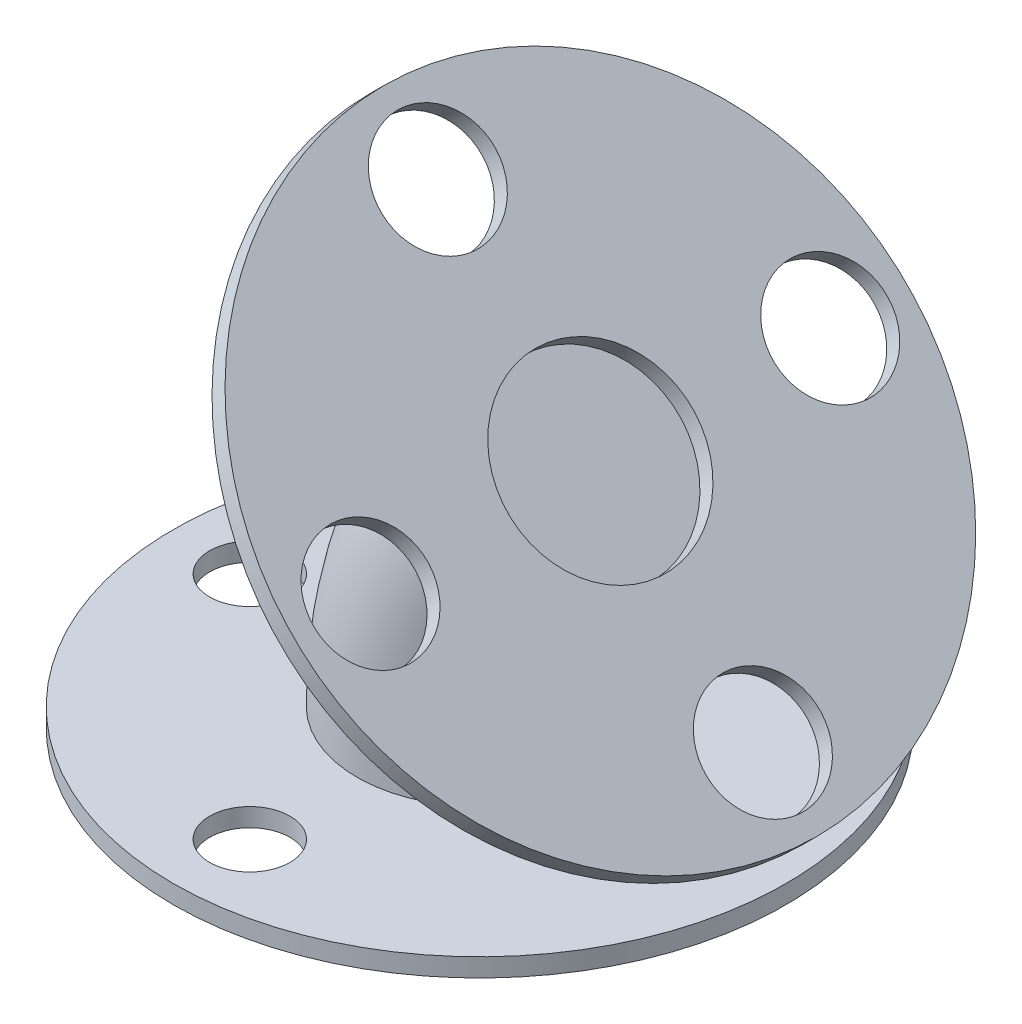
ISO-10303-21;
HEADER;
FILE_DESCRIPTION(('STEP AP214'),'2;1');
FILE_NAME('part.step','',(''),(''),'','','');
FILE_SCHEMA(('AUTOMOTIVE_DESIGN { 1 0 10303 214 1 1 1 1 }'));
ENDSEC;
DATA;
#1=APPLICATION_CONTEXT('core data for automotive mechanical design processes');
#2=APPLICATION_PROTOCOL_DEFINITION('international standard','automotive_design',2000,#1);
#3=PRODUCT_CONTEXT('',#1,'mechanical');
#4=PRODUCT('Part','Part','',(#3));
#5=PRODUCT_RELATED_PRODUCT_CATEGORY('part','',(#4));
#6=PRODUCT_DEFINITION_FORMATION('','',#4);
#7=PRODUCT_DEFINITION_CONTEXT('part definition',#1,'design');
#8=PRODUCT_DEFINITION('design','',#6,#7);
#9=PRODUCT_DEFINITION_SHAPE('','',#8);
#10=(LENGTH_UNIT() NAMED_UNIT(*) SI_UNIT(.MILLI.,.METRE.));
#11=(NAMED_UNIT(*) PLANE_ANGLE_UNIT() SI_UNIT($,.RADIAN.));
#12=(NAMED_UNIT(*) SI_UNIT($,.STERADIAN.) SOLID_ANGLE_UNIT());
#13=UNCERTAINTY_MEASURE_WITH_UNIT(LENGTH_MEASURE(1.E-05),#10,'distance_accuracy_value','');
#14=(GEOMETRIC_REPRESENTATION_CONTEXT(3) GLOBAL_UNCERTAINTY_ASSIGNED_CONTEXT((#13)) GLOBAL_UNIT_ASSIGNED_CONTEXT((#10,
#11,#12)) REPRESENTATION_CONTEXT('',''));
#15=CARTESIAN_POINT('',(0.,0.,0.));
#16=DIRECTION('',(0.,0.,1.));
#17=DIRECTION('',(1.,0.,0.));
#18=AXIS2_PLACEMENT_3D('',#15,#16,#17);
#19=CARTESIAN_POINT('',(0.,0.,0.));
#20=DIRECTION('',(0.,0.,1.));
#21=DIRECTION('',(1.,0.,0.));
#22=AXIS2_PLACEMENT_3D('',#19,#20,#21);
#23=TOROIDAL_SURFACE('',#22,60.,20.);
#24=CARTESIAN_POINT('',(-42.4264068711931,42.4264068711926,0.));
#25=DIRECTION('',(0.707106781186543,0.707106781186552,0.));
#26=DIRECTION('',(0.,0.,1.));
#27=AXIS2_PLACEMENT_3D('',#24,#25,#26);
#28=CIRCLE('',#27,20.);
#29=CARTESIAN_POINT('',(-56.5685424949241,56.5685424949235,0.));
#30=VERTEX_POINT('',#29);
#31=EDGE_CURVE('E10',#30,#30,#28,.T.);
#32=CARTESIAN_POINT('',(-60.,0.,0.));
#33=DIRECTION('',(0.,1.,0.));
#34=DIRECTION('',(0.,0.,1.));
#35=AXIS2_PLACEMENT_3D('',#32,#33,#34);
#36=CIRCLE('',#35,20.);
#37=CARTESIAN_POINT('',(-80.,0.,0.));
#38=VERTEX_POINT('',#37);
#39=EDGE_CURVE('E44',#38,#38,#36,.T.);
#40=CARTESIAN_POINT('',(0.,0.,0.));
#41=DIRECTION('',(0.,0.,1.));
#42=DIRECTION('',(1.,0.,0.));
#43=AXIS2_PLACEMENT_3D('',#40,#41,#42);
#44=CIRCLE('',#43,80.);
#45=EDGE_CURVE('',#30,#38,#44,.T.);
#46=ORIENTED_EDGE('',*,*,#31,.F.);
#47=ORIENTED_EDGE('',*,*,#39,.T.);
#48=ORIENTED_EDGE('',*,*,#45,.T.);
#49=ORIENTED_EDGE('',*,*,#45,.F.);
#50=EDGE_LOOP('',(#46,#48,#47,#49));
#51=FACE_BOUND('',#50,.T.);
#52=ADVANCED_FACE('F41',(#51),#23,.T.);
#53=CARTESIAN_POINT('',(-40.3050865276335,44.5477272147522,0.));
#54=DIRECTION('',(-0.707106781186543,-0.707106781186552,0.));
#55=DIRECTION('',(0.707106781186552,-0.707106781186543,0.));
#56=AXIS2_PLACEMENT_3D('',#53,#54,#55);
#57=CYLINDRICAL_SURFACE('',#56,50.);
#58=CARTESIAN_POINT('',(-40.3050865276335,44.5477272147522,0.));
#59=DIRECTION('',(0.707106781186543,0.707106781186552,0.));
#60=DIRECTION('',(-0.707106781186552,0.707106781186543,0.));
#61=AXIS2_PLACEMENT_3D('',#58,#59,#60);
#62=CIRCLE('',#61,50.);
#63=CARTESIAN_POINT('',(-75.660425586961,79.9030662740794,0.));
#64=VERTEX_POINT('',#63);
#65=EDGE_CURVE('E49',#64,#64,#62,.T.);
#66=ORIENTED_EDGE('',*,*,#65,.F.);
#67=EDGE_LOOP('',(#66));
#68=FACE_BOUND('',#67,.T.);
#69=CARTESIAN_POINT('',(-42.4264068711931,42.4264068711926,0.));
#70=DIRECTION('',(0.707106781186543,0.707106781186552,0.));
#71=DIRECTION('',(-0.707106781186552,0.707106781186543,0.));
#72=AXIS2_PLACEMENT_3D('',#69,#70,#71);
#73=CIRCLE('',#72,50.);
#74=CARTESIAN_POINT('',(-77.7817459305207,77.7817459305198,0.));
#75=VERTEX_POINT('',#74);
#76=EDGE_CURVE('E54',#75,#75,#73,.T.);
#77=ORIENTED_EDGE('',*,*,#76,.T.);
#78=EDGE_LOOP('',(#77));
#79=FACE_BOUND('',#78,.T.);
#80=ADVANCED_FACE('F181',(#68,#79),#57,.T.);
#81=CARTESIAN_POINT('',(-40.3050865276335,44.5477272147522,0.));
#82=DIRECTION('',(0.707106781186543,0.707106781186552,0.));
#83=DIRECTION('',(-0.707106781186552,0.707106781186543,0.));
#84=AXIS2_PLACEMENT_3D('',#81,#82,#83);
#85=PLANE('',#84);
#86=CARTESIAN_POINT('',(-66.8215908221292,71.0642315092476,0.));
#87=DIRECTION('',(0.707106781186543,0.707106781186552,0.));
#88=DIRECTION('',(-0.707106781186552,0.707106781186543,0.));
#89=AXIS2_PLACEMENT_3D('',#86,#87,#88);
#90=CIRCLE('',#89,9.26136337241677);
#91=CARTESIAN_POINT('',(-73.3703636657978,77.6130043529162,0.));
#92=VERTEX_POINT('',#91);
#93=EDGE_CURVE('E65',#92,#92,#90,.T.);
#94=ORIENTED_EDGE('',*,*,#93,.F.);
#95=EDGE_LOOP('',(#94));
#96=FACE_BOUND('',#95,.T.);
#97=CARTESIAN_POINT('',(-40.3050865276337,44.5477272147525,-37.5000000000005));
#98=DIRECTION('',(0.707106781186543,0.707106781186552,0.));
#99=DIRECTION('',(-0.707106781186552,0.707106781186543,0.));
#100=AXIS2_PLACEMENT_3D('',#97,#98,#99);
#101=CIRCLE('',#100,9.26136337241677);
#102=CARTESIAN_POINT('',(-46.8538593713024,51.0965000584211,-37.5000000000005));
#103=VERTEX_POINT('',#102);
#104=EDGE_CURVE('E73',#103,#103,#101,.T.);
#105=ORIENTED_EDGE('',*,*,#104,.F.);
#106=EDGE_LOOP('',(#105));
#107=FACE_BOUND('',#106,.T.);
#108=CARTESIAN_POINT('',(-13.7885822331378,18.0312229202569,-7.85583301239705E-13));
#109=DIRECTION('',(0.707106781186543,0.707106781186552,0.));
#110=DIRECTION('',(-0.707106781186552,0.707106781186543,0.));
#111=AXIS2_PLACEMENT_3D('',#108,#109,#110);
#112=CIRCLE('',#111,9.26136337241677);
#113=CARTESIAN_POINT('',(-20.3373550768064,24.5799957639254,-7.85583301239705E-13));
#114=VERTEX_POINT('',#113);
#115=EDGE_CURVE('E74',#114,#114,#112,.T.);
#116=ORIENTED_EDGE('',*,*,#115,.F.);
#117=EDGE_LOOP('',(#116));
#118=FACE_BOUND('',#117,.T.);
#119=CARTESIAN_POINT('',(-40.3050865276334,44.5477272147521,37.4999999999995));
#120=DIRECTION('',(0.707106781186543,0.707106781186552,0.));
#121=DIRECTION('',(-0.707106781186552,0.707106781186543,0.));
#122=AXIS2_PLACEMENT_3D('',#119,#120,#121);
#123=CIRCLE('',#122,9.26136337241677);
#124=CARTESIAN_POINT('',(-46.853859371302,51.0965000584207,37.4999999999995));
#125=VERTEX_POINT('',#124);
#126=EDGE_CURVE('E89',#125,#125,#123,.T.);
#127=ORIENTED_EDGE('',*,*,#126,.F.);
#128=EDGE_LOOP('',(#127));
#129=FACE_BOUND('',#128,.T.);
#130=CARTESIAN_POINT('',(-40.3050865276335,44.5477272147522,0.));
#131=DIRECTION('',(0.707106781186543,0.707106781186552,0.));
#132=DIRECTION('',(-0.707106781186552,0.707106781186543,0.));
#133=AXIS2_PLACEMENT_3D('',#130,#131,#132);
#134=CIRCLE('',#133,15.);
#135=CARTESIAN_POINT('',(-50.9116882454317,55.1543289325504,0.));
#136=VERTEX_POINT('',#135);
#137=EDGE_CURVE('E61',#136,#136,#134,.T.);
#138=ORIENTED_EDGE('',*,*,#137,.F.);
#139=EDGE_LOOP('',(#138));
#140=FACE_BOUND('',#139,.T.);
#141=ORIENTED_EDGE('',*,*,#65,.T.);
#142=EDGE_LOOP('',(#141));
#143=FACE_BOUND('',#142,.T.);
#144=ADVANCED_FACE('F186',(#96,#107,#118,#129,#140,#143),#85,.T.);
#145=CARTESIAN_POINT('',(-42.4264068711931,42.4264068711926,0.));
#146=DIRECTION('',(0.707106781186543,0.707106781186552,0.));
#147=DIRECTION('',(-0.707106781186552,0.707106781186543,0.));
#148=AXIS2_PLACEMENT_3D('',#145,#146,#147);
#149=PLANE('',#148);
#150=CARTESIAN_POINT('',(-68.9429111656888,68.942911165688,0.));
#151=DIRECTION('',(0.707106781186543,0.707106781186552,0.));
#152=DIRECTION('',(-0.707106781186552,0.707106781186543,0.));
#153=AXIS2_PLACEMENT_3D('',#150,#151,#152);
#154=CIRCLE('',#153,9.26136337241677);
#155=CARTESIAN_POINT('',(-75.4916840093574,75.4916840093565,0.));
#156=VERTEX_POINT('',#155);
#157=EDGE_CURVE('E78',#156,#156,#154,.T.);
#158=ORIENTED_EDGE('',*,*,#157,.T.);
#159=EDGE_LOOP('',(#158));
#160=FACE_BOUND('',#159,.T.);
#161=CARTESIAN_POINT('',(-42.4264068711934,42.4264068711929,-37.5000000000005));
#162=DIRECTION('',(0.707106781186543,0.707106781186552,0.));
#163=DIRECTION('',(-0.707106781186552,0.707106781186543,0.));
#164=AXIS2_PLACEMENT_3D('',#161,#162,#163);
#165=CIRCLE('',#164,9.26136337241677);
#166=CARTESIAN_POINT('',(-48.975179714862,48.9751797148614,-37.5000000000005));
#167=VERTEX_POINT('',#166);
#168=EDGE_CURVE('E69',#167,#167,#165,.T.);
#169=ORIENTED_EDGE('',*,*,#168,.T.);
#170=EDGE_LOOP('',(#169));
#171=FACE_BOUND('',#170,.T.);
#172=CARTESIAN_POINT('',(-15.9099025766974,15.9099025766972,-7.85583301239705E-13));
#173=DIRECTION('',(0.707106781186543,0.707106781186552,0.));
#174=DIRECTION('',(-0.707106781186552,0.707106781186543,0.));
#175=AXIS2_PLACEMENT_3D('',#172,#173,#174);
#176=CIRCLE('',#175,9.26136337241677);
#177=CARTESIAN_POINT('',(-22.4586754203661,22.4586754203658,-7.85583301239705E-13));
#178=VERTEX_POINT('',#177);
#179=EDGE_CURVE('E93',#178,#178,#176,.T.);
#180=ORIENTED_EDGE('',*,*,#179,.T.);
#181=EDGE_LOOP('',(#180));
#182=FACE_BOUND('',#181,.T.);
#183=CARTESIAN_POINT('',(-42.426406871193,42.4264068711925,37.4999999999995));
#184=DIRECTION('',(0.707106781186543,0.707106781186552,0.));
#185=DIRECTION('',(-0.707106781186552,0.707106781186543,0.));
#186=AXIS2_PLACEMENT_3D('',#183,#184,#185);
#187=CIRCLE('',#186,9.26136337241677);
#188=CARTESIAN_POINT('',(-48.9751797148616,48.9751797148611,37.4999999999995));
#189=VERTEX_POINT('',#188);
#190=EDGE_CURVE('E85',#189,#189,#187,.T.);
#191=ORIENTED_EDGE('',*,*,#190,.T.);
#192=EDGE_LOOP('',(#191));
#193=FACE_BOUND('',#192,.T.);
#194=ORIENTED_EDGE('',*,*,#31,.T.);
#195=EDGE_LOOP('',(#194));
#196=FACE_BOUND('',#195,.T.);
#197=ORIENTED_EDGE('',*,*,#76,.F.);
#198=EDGE_LOOP('',(#197));
#199=FACE_BOUND('',#198,.T.);
#200=ADVANCED_FACE('F196',(#160,#171,#182,#193,#196,#199),#149,.F.);
#201=CARTESIAN_POINT('',(-42.426406871193,42.4264068711925,37.4999999999995));
#202=DIRECTION('',(0.707106781186543,0.707106781186552,0.));
#203=DIRECTION('',(-0.707106781186552,0.707106781186543,0.));
#204=AXIS2_PLACEMENT_3D('',#201,#202,#203);
#205=CYLINDRICAL_SURFACE('',#204,9.26136337241677);
#206=ORIENTED_EDGE('',*,*,#190,.F.);
#207=EDGE_LOOP('',(#206));
#208=FACE_BOUND('',#207,.T.);
#209=ORIENTED_EDGE('',*,*,#126,.T.);
#210=EDGE_LOOP('',(#209));
#211=FACE_BOUND('',#210,.T.);
#212=ADVANCED_FACE('F203',(#208,#211),#205,.F.);
#213=CARTESIAN_POINT('',(-15.9099025766974,15.9099025766972,-7.85583301239705E-13));
#214=DIRECTION('',(0.707106781186543,0.707106781186552,0.));
#215=DIRECTION('',(-0.707106781186552,0.707106781186543,0.));
#216=AXIS2_PLACEMENT_3D('',#213,#214,#215);
#217=CYLINDRICAL_SURFACE('',#216,9.26136337241677);
#218=ORIENTED_EDGE('',*,*,#179,.F.);
#219=EDGE_LOOP('',(#218));
#220=FACE_BOUND('',#219,.T.);
#221=ORIENTED_EDGE('',*,*,#115,.T.);
#222=EDGE_LOOP('',(#221));
#223=FACE_BOUND('',#222,.T.);
#224=ADVANCED_FACE('F217',(#220,#223),#217,.F.);
#225=CARTESIAN_POINT('',(-42.4264068711934,42.4264068711929,-37.5000000000005));
#226=DIRECTION('',(0.707106781186543,0.707106781186552,0.));
#227=DIRECTION('',(-0.707106781186552,0.707106781186543,0.));
#228=AXIS2_PLACEMENT_3D('',#225,#226,#227);
#229=CYLINDRICAL_SURFACE('',#228,9.26136337241677);
#230=ORIENTED_EDGE('',*,*,#168,.F.);
#231=EDGE_LOOP('',(#230));
#232=FACE_BOUND('',#231,.T.);
#233=ORIENTED_EDGE('',*,*,#104,.T.);
#234=EDGE_LOOP('',(#233));
#235=FACE_BOUND('',#234,.T.);
#236=ADVANCED_FACE('F214',(#232,#235),#229,.F.);
#237=CARTESIAN_POINT('',(-68.9429111656888,68.942911165688,0.));
#238=DIRECTION('',(0.707106781186543,0.707106781186552,0.));
#239=DIRECTION('',(-0.707106781186552,0.707106781186543,0.));
#240=AXIS2_PLACEMENT_3D('',#237,#238,#239);
#241=CYLINDRICAL_SURFACE('',#240,9.26136337241677);
#242=ORIENTED_EDGE('',*,*,#157,.F.);
#243=EDGE_LOOP('',(#242));
#244=FACE_BOUND('',#243,.T.);
#245=ORIENTED_EDGE('',*,*,#93,.T.);
#246=EDGE_LOOP('',(#245));
#247=FACE_BOUND('',#246,.T.);
#248=ADVANCED_FACE('F209',(#244,#247),#241,.F.);
#249=CARTESIAN_POINT('',(-42.4264068711931,42.4264068711926,0.));
#250=DIRECTION('',(0.707106781186543,0.707106781186552,0.));
#251=DIRECTION('',(-0.707106781186552,0.707106781186543,0.));
#252=AXIS2_PLACEMENT_3D('',#249,#250,#251);
#253=CYLINDRICAL_SURFACE('',#252,15.);
#254=CARTESIAN_POINT('',(-42.4264068711931,42.4264068711926,0.));
#255=DIRECTION('',(0.707106781186543,0.707106781186552,0.));
#256=DIRECTION('',(-0.707106781186552,0.707106781186543,0.));
#257=AXIS2_PLACEMENT_3D('',#254,#255,#256);
#258=CIRCLE('',#257,15.);
#259=CARTESIAN_POINT('',(-53.0330085889914,53.0330085889907,0.));
#260=VERTEX_POINT('',#259);
#261=EDGE_CURVE('E59',#260,#260,#258,.T.);
#262=ORIENTED_EDGE('',*,*,#261,.F.);
#263=EDGE_LOOP('',(#262));
#264=FACE_BOUND('',#263,.T.);
#265=ORIENTED_EDGE('',*,*,#137,.T.);
#266=EDGE_LOOP('',(#265));
#267=FACE_BOUND('',#266,.T.);
#268=ADVANCED_FACE('F206',(#264,#267),#253,.F.);
#269=CARTESIAN_POINT('',(-42.4264068711931,42.4264068711926,0.));
#270=DIRECTION('',(0.707106781186543,0.707106781186552,0.));
#271=DIRECTION('',(-0.707106781186552,0.707106781186543,0.));
#272=AXIS2_PLACEMENT_3D('',#269,#270,#271);
#273=PLANE('',#272);
#274=ORIENTED_EDGE('',*,*,#261,.T.);
#275=EDGE_LOOP('',(#274));
#276=FACE_BOUND('',#275,.T.);
#277=ADVANCED_FACE('F166',(#276),#273,.T.);
#278=CARTESIAN_POINT('',(-60.,-3.,0.));
#279=DIRECTION('',(0.,1.,0.));
#280=DIRECTION('',(0.,0.,1.));
#281=AXIS2_PLACEMENT_3D('',#278,#279,#280);
#282=CYLINDRICAL_SURFACE('',#281,50.);
#283=CARTESIAN_POINT('',(-60.,-3.,0.));
#284=DIRECTION('',(0.,-1.,0.));
#285=DIRECTION('',(0.,0.,-1.));
#286=AXIS2_PLACEMENT_3D('',#283,#284,#285);
#287=CIRCLE('',#286,50.);
#288=CARTESIAN_POINT('',(-60.,-3.,-50.));
#289=VERTEX_POINT('',#288);
#290=EDGE_CURVE('E104',#289,#289,#287,.T.);
#291=ORIENTED_EDGE('',*,*,#290,.F.);
#292=EDGE_LOOP('',(#291));
#293=FACE_BOUND('',#292,.T.);
#294=CARTESIAN_POINT('',(-60.,0.,0.));
#295=DIRECTION('',(0.,-1.,0.));
#296=DIRECTION('',(0.,0.,-1.));
#297=AXIS2_PLACEMENT_3D('',#294,#295,#296);
#298=CIRCLE('',#297,50.);
#299=CARTESIAN_POINT('',(-60.,0.,-50.));
#300=VERTEX_POINT('',#299);
#301=EDGE_CURVE('E100',#300,#300,#298,.T.);
#302=ORIENTED_EDGE('',*,*,#301,.T.);
#303=EDGE_LOOP('',(#302));
#304=FACE_BOUND('',#303,.T.);
#305=ADVANCED_FACE('F155',(#293,#304),#282,.T.);
#306=CARTESIAN_POINT('',(-60.,-3.,0.));
#307=DIRECTION('',(0.,-1.,0.));
#308=DIRECTION('',(0.,0.,-1.));
#309=AXIS2_PLACEMENT_3D('',#306,#307,#308);
#310=PLANE('',#309);
#311=CARTESIAN_POINT('',(-60.,-3.,37.5));
#312=DIRECTION('',(0.,-1.,0.));
#313=DIRECTION('',(0.,0.,-1.));
#314=AXIS2_PLACEMENT_3D('',#311,#312,#313);
#315=CIRCLE('',#314,6.54713408897914);
#316=CARTESIAN_POINT('',(-60.,-3.,30.9528659110209));
#317=VERTEX_POINT('',#316);
#318=EDGE_CURVE('E113',#317,#317,#315,.T.);
#319=ORIENTED_EDGE('',*,*,#318,.F.);
#320=EDGE_LOOP('',(#319));
#321=FACE_BOUND('',#320,.T.);
#322=CARTESIAN_POINT('',(-22.4999999999995,-3.,3.88578058618805E-13));
#323=DIRECTION('',(0.,-1.,0.));
#324=DIRECTION('',(0.,0.,-1.));
#325=AXIS2_PLACEMENT_3D('',#322,#323,#324);
#326=CIRCLE('',#325,6.54713408897914);
#327=CARTESIAN_POINT('',(-22.4999999999995,-3.,-6.54713408897875));
#328=VERTEX_POINT('',#327);
#329=EDGE_CURVE('E121',#328,#328,#326,.T.);
#330=ORIENTED_EDGE('',*,*,#329,.F.);
#331=EDGE_LOOP('',(#330));
#332=FACE_BOUND('',#331,.T.);
#333=CARTESIAN_POINT('',(-59.9999999999992,-3.,-37.5));
#334=DIRECTION('',(0.,-1.,0.));
#335=DIRECTION('',(0.,0.,-1.));
#336=AXIS2_PLACEMENT_3D('',#333,#334,#335);
#337=CIRCLE('',#336,6.54713408897913);
#338=CARTESIAN_POINT('',(-59.9999999999992,-3.,-44.0471340889791));
#339=VERTEX_POINT('',#338);
#340=EDGE_CURVE('E122',#339,#339,#337,.T.);
#341=ORIENTED_EDGE('',*,*,#340,.F.);
#342=EDGE_LOOP('',(#341));
#343=FACE_BOUND('',#342,.T.);
#344=CARTESIAN_POINT('',(-97.4999999999995,-3.,-1.2490009027033E-13));
#345=DIRECTION('',(0.,-1.,0.));
#346=DIRECTION('',(0.,0.,-1.));
#347=AXIS2_PLACEMENT_3D('',#344,#345,#346);
#348=CIRCLE('',#347,6.54713408897913);
#349=CARTESIAN_POINT('',(-97.4999999999995,-3.,-6.54713408897926));
#350=VERTEX_POINT('',#349);
#351=EDGE_CURVE('E137',#350,#350,#348,.T.);
#352=ORIENTED_EDGE('',*,*,#351,.F.);
#353=EDGE_LOOP('',(#352));
#354=FACE_BOUND('',#353,.T.);
#355=CARTESIAN_POINT('',(-60.,-3.,0.));
#356=DIRECTION('',(0.,-1.,0.));
#357=DIRECTION('',(0.,0.,-1.));
#358=AXIS2_PLACEMENT_3D('',#355,#356,#357);
#359=CIRCLE('',#358,15.);
#360=CARTESIAN_POINT('',(-60.,-3.,-15.));
#361=VERTEX_POINT('',#360);
#362=EDGE_CURVE('E109',#361,#361,#359,.T.);
#363=ORIENTED_EDGE('',*,*,#362,.F.);
#364=EDGE_LOOP('',(#363));
#365=FACE_BOUND('',#364,.T.);
#366=ORIENTED_EDGE('',*,*,#290,.T.);
#367=EDGE_LOOP('',(#366));
#368=FACE_BOUND('',#367,.T.);
#369=ADVANCED_FACE('F151',(#321,#332,#343,#354,#365,#368),#310,.T.);
#370=CARTESIAN_POINT('',(-60.,0.,0.));
#371=DIRECTION('',(0.,-1.,0.));
#372=DIRECTION('',(0.,0.,-1.));
#373=AXIS2_PLACEMENT_3D('',#370,#371,#372);
#374=PLANE('',#373);
#375=CARTESIAN_POINT('',(-60.,0.,37.5));
#376=DIRECTION('',(0.,-1.,0.));
#377=DIRECTION('',(0.,0.,-1.));
#378=AXIS2_PLACEMENT_3D('',#375,#376,#377);
#379=CIRCLE('',#378,6.54713408897914);
#380=CARTESIAN_POINT('',(-60.,0.,30.9528659110209));
#381=VERTEX_POINT('',#380);
#382=EDGE_CURVE('E126',#381,#381,#379,.T.);
#383=ORIENTED_EDGE('',*,*,#382,.T.);
#384=EDGE_LOOP('',(#383));
#385=FACE_BOUND('',#384,.T.);
#386=CARTESIAN_POINT('',(-22.4999999999995,0.,3.88578058618805E-13));
#387=DIRECTION('',(0.,-1.,0.));
#388=DIRECTION('',(0.,0.,-1.));
#389=AXIS2_PLACEMENT_3D('',#386,#387,#388);
#390=CIRCLE('',#389,6.54713408897914);
#391=CARTESIAN_POINT('',(-22.4999999999995,0.,-6.54713408897875));
#392=VERTEX_POINT('',#391);
#393=EDGE_CURVE('E117',#392,#392,#390,.T.);
#394=ORIENTED_EDGE('',*,*,#393,.T.);
#395=EDGE_LOOP('',(#394));
#396=FACE_BOUND('',#395,.T.);
#397=CARTESIAN_POINT('',(-59.9999999999992,0.,-37.5));
#398=DIRECTION('',(0.,-1.,0.));
#399=DIRECTION('',(0.,0.,-1.));
#400=AXIS2_PLACEMENT_3D('',#397,#398,#399);
#401=CIRCLE('',#400,6.54713408897913);
#402=CARTESIAN_POINT('',(-59.9999999999992,0.,-44.0471340889791));
#403=VERTEX_POINT('',#402);
#404=EDGE_CURVE('E141',#403,#403,#401,.T.);
#405=ORIENTED_EDGE('',*,*,#404,.T.);
#406=EDGE_LOOP('',(#405));
#407=FACE_BOUND('',#406,.T.);
#408=CARTESIAN_POINT('',(-97.4999999999995,0.,-1.2490009027033E-13));
#409=DIRECTION('',(0.,-1.,0.));
#410=DIRECTION('',(0.,0.,-1.));
#411=AXIS2_PLACEMENT_3D('',#408,#409,#410);
#412=CIRCLE('',#411,6.54713408897913);
#413=CARTESIAN_POINT('',(-97.4999999999995,0.,-6.54713408897926));
#414=VERTEX_POINT('',#413);
#415=EDGE_CURVE('E133',#414,#414,#412,.T.);
#416=ORIENTED_EDGE('',*,*,#415,.T.);
#417=EDGE_LOOP('',(#416));
#418=FACE_BOUND('',#417,.T.);
#419=ORIENTED_EDGE('',*,*,#39,.F.);
#420=EDGE_LOOP('',(#419));
#421=FACE_BOUND('',#420,.T.);
#422=ORIENTED_EDGE('',*,*,#301,.F.);
#423=EDGE_LOOP('',(#422));
#424=FACE_BOUND('',#423,.T.);
#425=ADVANCED_FACE('F154',(#385,#396,#407,#418,#421,#424),#374,.F.);
#426=CARTESIAN_POINT('',(-97.4999999999995,0.,-1.2490009027033E-13));
#427=DIRECTION('',(0.,-1.,0.));
#428=DIRECTION('',(0.,0.,-1.));
#429=AXIS2_PLACEMENT_3D('',#426,#427,#428);
#430=CYLINDRICAL_SURFACE('',#429,6.54713408897913);
#431=ORIENTED_EDGE('',*,*,#415,.F.);
#432=EDGE_LOOP('',(#431));
#433=FACE_BOUND('',#432,.T.);
#434=ORIENTED_EDGE('',*,*,#351,.T.);
#435=EDGE_LOOP('',(#434));
#436=FACE_BOUND('',#435,.T.);
#437=ADVANCED_FACE('F171',(#433,#436),#430,.F.);
#438=CARTESIAN_POINT('',(-59.9999999999992,0.,-37.5));
#439=DIRECTION('',(0.,-1.,0.));
#440=DIRECTION('',(0.,0.,-1.));
#441=AXIS2_PLACEMENT_3D('',#438,#439,#440);
#442=CYLINDRICAL_SURFACE('',#441,6.54713408897913);
#443=ORIENTED_EDGE('',*,*,#404,.F.);
#444=EDGE_LOOP('',(#443));
#445=FACE_BOUND('',#444,.T.);
#446=ORIENTED_EDGE('',*,*,#340,.T.);
#447=EDGE_LOOP('',(#446));
#448=FACE_BOUND('',#447,.T.);
#449=ADVANCED_FACE('F149',(#445,#448),#442,.F.);
#450=CARTESIAN_POINT('',(-22.4999999999995,0.,3.88578058618805E-13));
#451=DIRECTION('',(0.,-1.,0.));
#452=DIRECTION('',(0.,0.,-1.));
#453=AXIS2_PLACEMENT_3D('',#450,#451,#452);
#454=CYLINDRICAL_SURFACE('',#453,6.54713408897914);
#455=ORIENTED_EDGE('',*,*,#393,.F.);
#456=EDGE_LOOP('',(#455));
#457=FACE_BOUND('',#456,.T.);
#458=ORIENTED_EDGE('',*,*,#329,.T.);
#459=EDGE_LOOP('',(#458));
#460=FACE_BOUND('',#459,.T.);
#461=ADVANCED_FACE('F293',(#457,#460),#454,.F.);
#462=CARTESIAN_POINT('',(-60.,0.,37.5));
#463=DIRECTION('',(0.,-1.,0.));
#464=DIRECTION('',(0.,0.,-1.));
#465=AXIS2_PLACEMENT_3D('',#462,#463,#464);
#466=CYLINDRICAL_SURFACE('',#465,6.54713408897914);
#467=ORIENTED_EDGE('',*,*,#382,.F.);
#468=EDGE_LOOP('',(#467));
#469=FACE_BOUND('',#468,.T.);
#470=ORIENTED_EDGE('',*,*,#318,.T.);
#471=EDGE_LOOP('',(#470));
#472=FACE_BOUND('',#471,.T.);
#473=ADVANCED_FACE('F304',(#469,#472),#466,.F.);
#474=CARTESIAN_POINT('',(-60.,0.,0.));
#475=DIRECTION('',(0.,-1.,0.));
#476=DIRECTION('',(0.,0.,-1.));
#477=AXIS2_PLACEMENT_3D('',#474,#475,#476);
#478=CYLINDRICAL_SURFACE('',#477,15.);
#479=CARTESIAN_POINT('',(-60.,0.,0.));
#480=DIRECTION('',(0.,-1.,0.));
#481=DIRECTION('',(0.,0.,-1.));
#482=AXIS2_PLACEMENT_3D('',#479,#480,#481);
#483=CIRCLE('',#482,15.);
#484=CARTESIAN_POINT('',(-60.,0.,-15.));
#485=VERTEX_POINT('',#484);
#486=EDGE_CURVE('E105',#485,#485,#483,.T.);
#487=ORIENTED_EDGE('',*,*,#486,.F.);
#488=EDGE_LOOP('',(#487));
#489=FACE_BOUND('',#488,.T.);
#490=ORIENTED_EDGE('',*,*,#362,.T.);
#491=EDGE_LOOP('',(#490));
#492=FACE_BOUND('',#491,.T.);
#493=ADVANCED_FACE('F315',(#489,#492),#478,.F.);
#494=CARTESIAN_POINT('',(-60.,0.,0.));
#495=DIRECTION('',(0.,-1.,0.));
#496=DIRECTION('',(0.,0.,-1.));
#497=AXIS2_PLACEMENT_3D('',#494,#495,#496);
#498=PLANE('',#497);
#499=ORIENTED_EDGE('',*,*,#486,.T.);
#500=EDGE_LOOP('',(#499));
#501=FACE_BOUND('',#500,.T.);
#502=ADVANCED_FACE('F326',(#501),#498,.T.);
#503=CLOSED_SHELL('',(#52,#80,#144,#200,#212,#224,#236,#248,#268,#277,#305,#369,#425,#437,#449,
#461,#473,#493,#502));
#504=MANIFOLD_SOLID_BREP('B2',#503);
#505=ADVANCED_BREP_SHAPE_REPRESENTATION('',(#18,#504),#14);
#506=SHAPE_DEFINITION_REPRESENTATION(#9,#505);
ENDSEC;
END-ISO-10303-21;
